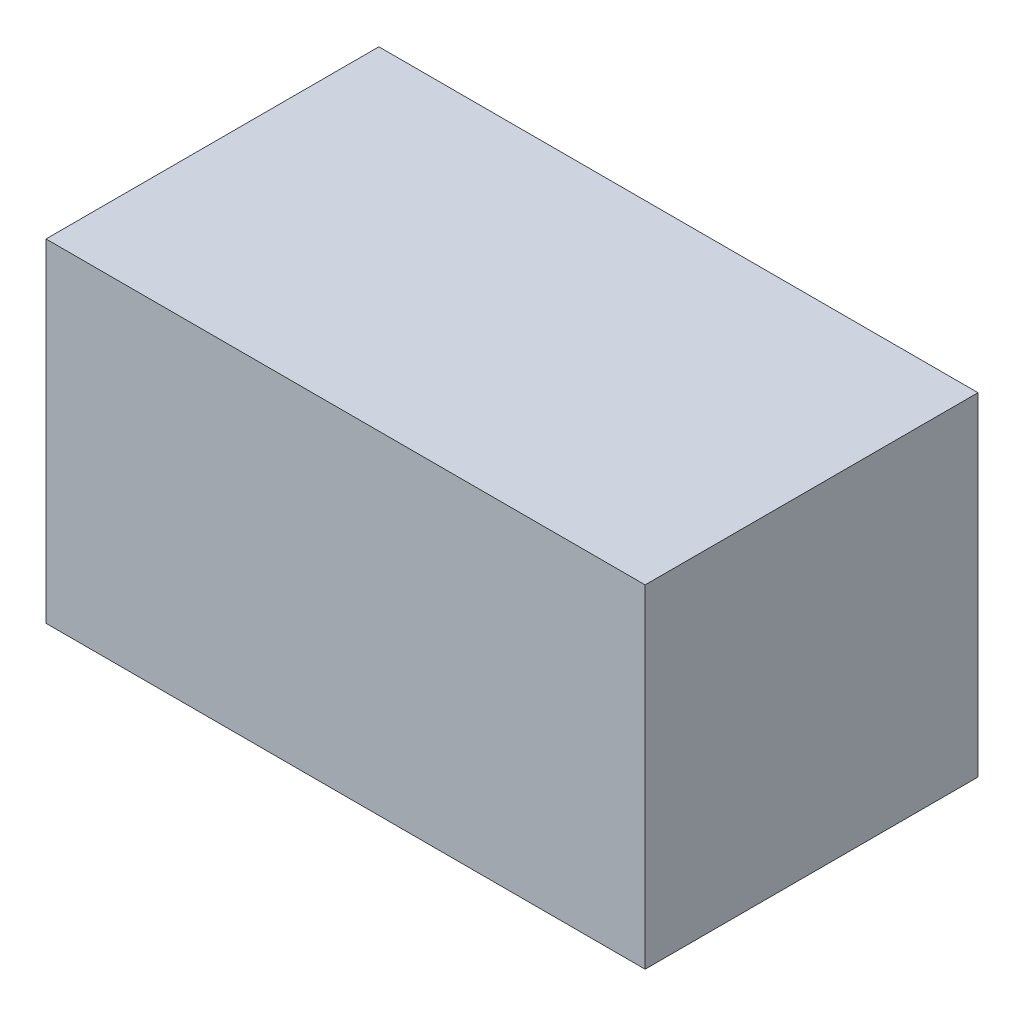
ISO-10303-21;
HEADER;
FILE_DESCRIPTION(('STEP AP214'),'2;1');
FILE_NAME('part.step','',(''),(''),'','','');
FILE_SCHEMA(('AUTOMOTIVE_DESIGN { 1 0 10303 214 1 1 1 1 }'));
ENDSEC;
DATA;
#1=APPLICATION_CONTEXT('core data for automotive mechanical design processes');
#2=APPLICATION_PROTOCOL_DEFINITION('international standard','automotive_design',2000,#1);
#3=PRODUCT_CONTEXT('',#1,'mechanical');
#4=PRODUCT('Part','Part','',(#3));
#5=PRODUCT_RELATED_PRODUCT_CATEGORY('part','',(#4));
#6=PRODUCT_DEFINITION_FORMATION('','',#4);
#7=PRODUCT_DEFINITION_CONTEXT('part definition',#1,'design');
#8=PRODUCT_DEFINITION('design','',#6,#7);
#9=PRODUCT_DEFINITION_SHAPE('','',#8);
#10=(LENGTH_UNIT() NAMED_UNIT(*) SI_UNIT(.MILLI.,.METRE.));
#11=(NAMED_UNIT(*) PLANE_ANGLE_UNIT() SI_UNIT($,.RADIAN.));
#12=(NAMED_UNIT(*) SI_UNIT($,.STERADIAN.) SOLID_ANGLE_UNIT());
#13=UNCERTAINTY_MEASURE_WITH_UNIT(LENGTH_MEASURE(1.E-05),#10,'distance_accuracy_value','');
#14=(GEOMETRIC_REPRESENTATION_CONTEXT(3) GLOBAL_UNCERTAINTY_ASSIGNED_CONTEXT((#13)) GLOBAL_UNIT_ASSIGNED_CONTEXT((#10,
#11,#12)) REPRESENTATION_CONTEXT('',''));
#15=CARTESIAN_POINT('',(0.,0.,0.));
#16=DIRECTION('',(0.,0.,1.));
#17=DIRECTION('',(1.,0.,0.));
#18=AXIS2_PLACEMENT_3D('',#15,#16,#17);
#19=CARTESIAN_POINT('',(-97.9498861047837,100.,-42.8246013667426));
#20=DIRECTION('',(1.,0.,0.));
#21=DIRECTION('',(0.,0.,-1.));
#22=AXIS2_PLACEMENT_3D('',#19,#20,#21);
#23=PLANE('',#22);
#24=DIRECTION('',(0.,0.,1.));
#25=VECTOR('',#24,1.);
#26=CARTESIAN_POINT('',(-97.9498861047837,0.,-42.8246013667426));
#27=LINE('',#26,#25);
#28=CARTESIAN_POINT('',(-97.9498861047837,0.,-42.8246013667426));
#29=VERTEX_POINT('',#28);
#30=CARTESIAN_POINT('',(-97.9498861047836,0.,57.1753986332574));
#31=VERTEX_POINT('',#30);
#32=EDGE_CURVE('E98',#29,#31,#27,.T.);
#33=ORIENTED_EDGE('',*,*,#32,.T.);
#34=DIRECTION('',(0.,-1.,0.));
#35=VECTOR('',#34,1.);
#36=CARTESIAN_POINT('',(-97.9498861047836,100.,57.1753986332574));
#37=LINE('',#36,#35);
#38=CARTESIAN_POINT('',(-97.9498861047836,100.,57.1753986332574));
#39=VERTEX_POINT('',#38);
#40=EDGE_CURVE('E11',#39,#31,#37,.T.);
#41=ORIENTED_EDGE('',*,*,#40,.F.);
#42=DIRECTION('',(0.,0.,1.));
#43=VECTOR('',#42,1.);
#44=CARTESIAN_POINT('',(-97.9498861047837,100.,-42.8246013667426));
#45=LINE('',#44,#43);
#46=CARTESIAN_POINT('',(-97.9498861047837,100.,-42.8246013667426));
#47=VERTEX_POINT('',#46);
#48=EDGE_CURVE('E84',#47,#39,#45,.T.);
#49=ORIENTED_EDGE('',*,*,#48,.F.);
#50=DIRECTION('',(0.,-1.,0.));
#51=VECTOR('',#50,1.);
#52=CARTESIAN_POINT('',(-97.9498861047837,100.,-42.8246013667426));
#53=LINE('',#52,#51);
#54=EDGE_CURVE('E51',#47,#29,#53,.T.);
#55=ORIENTED_EDGE('',*,*,#54,.T.);
#56=EDGE_LOOP('',(#33,#41,#49,#55));
#57=FACE_BOUND('',#56,.T.);
#58=ADVANCED_FACE('F35',(#57),#23,.F.);
#59=CARTESIAN_POINT('',(-97.9498861047836,100.,57.1753986332574));
#60=DIRECTION('',(0.,0.,-1.));
#61=DIRECTION('',(-1.,0.,0.));
#62=AXIS2_PLACEMENT_3D('',#59,#60,#61);
#63=PLANE('',#62);
#64=DIRECTION('',(1.,0.,0.));
#65=VECTOR('',#64,1.);
#66=CARTESIAN_POINT('',(-97.9498861047836,0.,57.1753986332574));
#67=LINE('',#66,#65);
#68=CARTESIAN_POINT('',(82.0501138952163,0.,57.1753986332574));
#69=VERTEX_POINT('',#68);
#70=EDGE_CURVE('E89',#31,#69,#67,.T.);
#71=ORIENTED_EDGE('',*,*,#70,.T.);
#72=DIRECTION('',(0.,-1.,0.));
#73=VECTOR('',#72,1.);
#74=CARTESIAN_POINT('',(82.0501138952163,100.,57.1753986332574));
#75=LINE('',#74,#73);
#76=CARTESIAN_POINT('',(82.0501138952163,100.,57.1753986332574));
#77=VERTEX_POINT('',#76);
#78=EDGE_CURVE('E43',#77,#69,#75,.T.);
#79=ORIENTED_EDGE('',*,*,#78,.F.);
#80=DIRECTION('',(1.,0.,0.));
#81=VECTOR('',#80,1.);
#82=CARTESIAN_POINT('',(-97.9498861047836,100.,57.1753986332574));
#83=LINE('',#82,#81);
#84=EDGE_CURVE('E76',#39,#77,#83,.T.);
#85=ORIENTED_EDGE('',*,*,#84,.F.);
#86=ORIENTED_EDGE('',*,*,#40,.T.);
#87=EDGE_LOOP('',(#71,#79,#85,#86));
#88=FACE_BOUND('',#87,.T.);
#89=ADVANCED_FACE('F88',(#88),#63,.F.);
#90=CARTESIAN_POINT('',(82.0501138952163,100.,-42.8246013667426));
#91=DIRECTION('',(1.,0.,0.));
#92=DIRECTION('',(0.,0.,-1.));
#93=AXIS2_PLACEMENT_3D('',#90,#91,#92);
#94=PLANE('',#93);
#95=DIRECTION('',(0.,0.,1.));
#96=VECTOR('',#95,1.);
#97=CARTESIAN_POINT('',(82.0501138952163,0.,-42.8246013667426));
#98=LINE('',#97,#96);
#99=CARTESIAN_POINT('',(82.0501138952163,0.,-42.8246013667426));
#100=VERTEX_POINT('',#99);
#101=EDGE_CURVE('E101',#100,#69,#98,.T.);
#102=ORIENTED_EDGE('',*,*,#101,.F.);
#103=DIRECTION('',(0.,-1.,0.));
#104=VECTOR('',#103,1.);
#105=CARTESIAN_POINT('',(82.0501138952163,100.,-42.8246013667426));
#106=LINE('',#105,#104);
#107=CARTESIAN_POINT('',(82.0501138952163,100.,-42.8246013667426));
#108=VERTEX_POINT('',#107);
#109=EDGE_CURVE('E65',#108,#100,#106,.T.);
#110=ORIENTED_EDGE('',*,*,#109,.F.);
#111=DIRECTION('',(0.,0.,1.));
#112=VECTOR('',#111,1.);
#113=CARTESIAN_POINT('',(82.0501138952163,100.,-42.8246013667426));
#114=LINE('',#113,#112);
#115=EDGE_CURVE('E83',#108,#77,#114,.T.);
#116=ORIENTED_EDGE('',*,*,#115,.T.);
#117=ORIENTED_EDGE('',*,*,#78,.T.);
#118=EDGE_LOOP('',(#102,#110,#116,#117));
#119=FACE_BOUND('',#118,.T.);
#120=ADVANCED_FACE('F92',(#119),#94,.T.);
#121=CARTESIAN_POINT('',(-97.9498861047837,100.,-42.8246013667426));
#122=DIRECTION('',(0.,0.,-1.));
#123=DIRECTION('',(-1.,0.,0.));
#124=AXIS2_PLACEMENT_3D('',#121,#122,#123);
#125=PLANE('',#124);
#126=DIRECTION('',(1.,0.,0.));
#127=VECTOR('',#126,1.);
#128=CARTESIAN_POINT('',(-97.9498861047837,0.,-42.8246013667426));
#129=LINE('',#128,#127);
#130=EDGE_CURVE('E103',#29,#100,#129,.T.);
#131=ORIENTED_EDGE('',*,*,#130,.F.);
#132=ORIENTED_EDGE('',*,*,#54,.F.);
#133=DIRECTION('',(1.,0.,0.));
#134=VECTOR('',#133,1.);
#135=CARTESIAN_POINT('',(-97.9498861047837,100.,-42.8246013667426));
#136=LINE('',#135,#134);
#137=EDGE_CURVE('E93',#47,#108,#136,.T.);
#138=ORIENTED_EDGE('',*,*,#137,.T.);
#139=ORIENTED_EDGE('',*,*,#109,.T.);
#140=EDGE_LOOP('',(#131,#132,#138,#139));
#141=FACE_BOUND('',#140,.T.);
#142=ADVANCED_FACE('F109',(#141),#125,.T.);
#143=CARTESIAN_POINT('',(0.,100.,0.));
#144=DIRECTION('',(0.,1.,0.));
#145=DIRECTION('',(0.,0.,1.));
#146=AXIS2_PLACEMENT_3D('',#143,#144,#145);
#147=PLANE('',#146);
#148=ORIENTED_EDGE('',*,*,#48,.T.);
#149=ORIENTED_EDGE('',*,*,#84,.T.);
#150=ORIENTED_EDGE('',*,*,#115,.F.);
#151=ORIENTED_EDGE('',*,*,#137,.F.);
#152=EDGE_LOOP('',(#148,#149,#150,#151));
#153=FACE_BOUND('',#152,.T.);
#154=ADVANCED_FACE('F80',(#153),#147,.T.);
#155=CARTESIAN_POINT('',(0.,0.,0.));
#156=DIRECTION('',(0.,1.,0.));
#157=DIRECTION('',(0.,0.,1.));
#158=AXIS2_PLACEMENT_3D('',#155,#156,#157);
#159=PLANE('',#158);
#160=ORIENTED_EDGE('',*,*,#32,.F.);
#161=ORIENTED_EDGE('',*,*,#130,.T.);
#162=ORIENTED_EDGE('',*,*,#101,.T.);
#163=ORIENTED_EDGE('',*,*,#70,.F.);
#164=EDGE_LOOP('',(#160,#161,#162,#163));
#165=FACE_BOUND('',#164,.T.);
#166=ADVANCED_FACE('F108',(#165),#159,.F.);
#167=CLOSED_SHELL('',(#58,#89,#120,#142,#154,#166));
#168=MANIFOLD_SOLID_BREP('B2',#167);
#169=ADVANCED_BREP_SHAPE_REPRESENTATION('',(#18,#168),#14);
#170=SHAPE_DEFINITION_REPRESENTATION(#9,#169);
ENDSEC;
END-ISO-10303-21;
